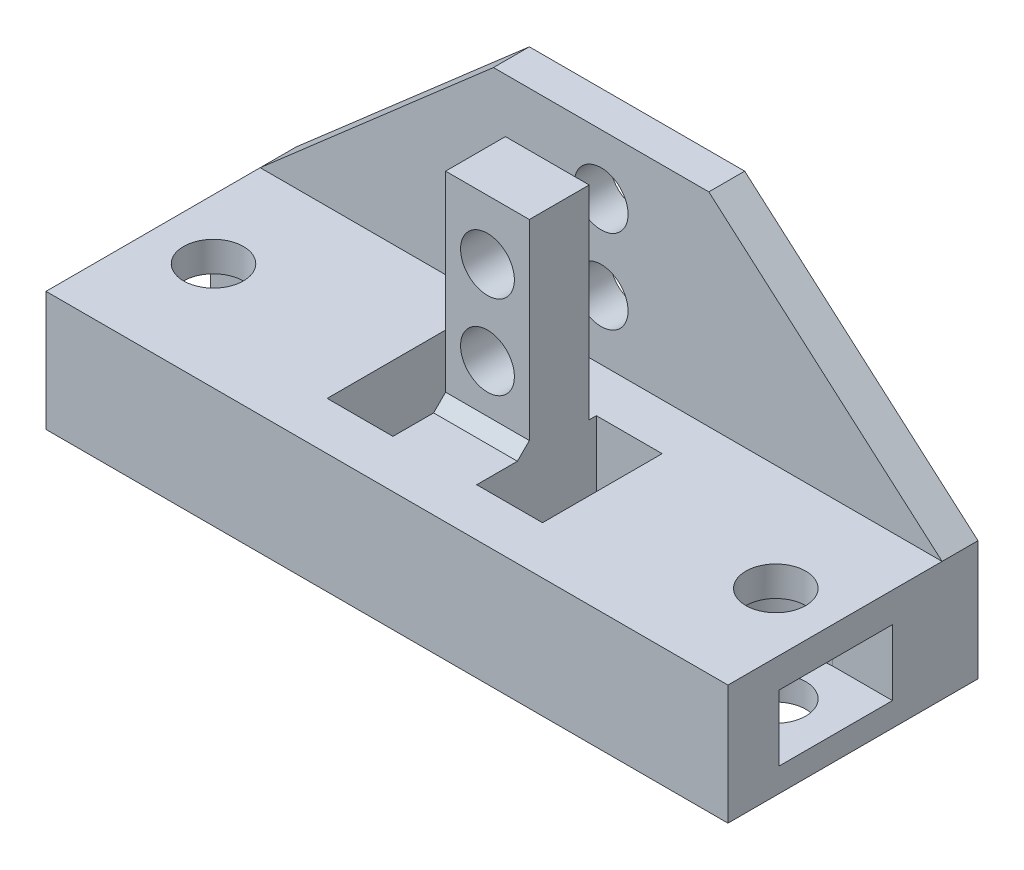
ISO-10303-21;
HEADER;
FILE_DESCRIPTION(('STEP AP214'),'2;1');
FILE_NAME('part.step','',(''),(''),'','','');
FILE_SCHEMA(('AUTOMOTIVE_DESIGN { 1 0 10303 214 1 1 1 1 }'));
ENDSEC;
DATA;
#1=APPLICATION_CONTEXT('core data for automotive mechanical design processes');
#2=APPLICATION_PROTOCOL_DEFINITION('international standard','automotive_design',2000,#1);
#3=PRODUCT_CONTEXT('',#1,'mechanical');
#4=PRODUCT('Part','Part','',(#3));
#5=PRODUCT_RELATED_PRODUCT_CATEGORY('part','',(#4));
#6=PRODUCT_DEFINITION_FORMATION('','',#4);
#7=PRODUCT_DEFINITION_CONTEXT('part definition',#1,'design');
#8=PRODUCT_DEFINITION('design','',#6,#7);
#9=PRODUCT_DEFINITION_SHAPE('','',#8);
#10=(LENGTH_UNIT() NAMED_UNIT(*) SI_UNIT(.MILLI.,.METRE.));
#11=(NAMED_UNIT(*) PLANE_ANGLE_UNIT() SI_UNIT($,.RADIAN.));
#12=(NAMED_UNIT(*) SI_UNIT($,.STERADIAN.) SOLID_ANGLE_UNIT());
#13=UNCERTAINTY_MEASURE_WITH_UNIT(LENGTH_MEASURE(1.E-05),#10,'distance_accuracy_value','');
#14=(GEOMETRIC_REPRESENTATION_CONTEXT(3) GLOBAL_UNCERTAINTY_ASSIGNED_CONTEXT((#13)) GLOBAL_UNIT_ASSIGNED_CONTEXT((#10,
#11,#12)) REPRESENTATION_CONTEXT('',''));
#15=CARTESIAN_POINT('',(0.,0.,0.));
#16=DIRECTION('',(0.,0.,1.));
#17=DIRECTION('',(1.,0.,0.));
#18=AXIS2_PLACEMENT_3D('',#15,#16,#17);
#19=CARTESIAN_POINT('',(38.5,0.,0.));
#20=DIRECTION('',(1.,0.,0.));
#21=DIRECTION('',(0.,0.,-1.));
#22=AXIS2_PLACEMENT_3D('',#19,#20,#21);
#23=PLANE('',#22);
#24=DIRECTION('',(0.,-1.,0.));
#25=VECTOR('',#24,1.);
#26=CARTESIAN_POINT('',(38.5,0.,13.4));
#27=LINE('',#26,#25);
#28=CARTESIAN_POINT('',(38.5,0.,13.4));
#29=VERTEX_POINT('',#28);
#30=CARTESIAN_POINT('',(38.5,-10.,13.4));
#31=VERTEX_POINT('',#30);
#32=EDGE_CURVE('E364',#29,#31,#27,.T.);
#33=ORIENTED_EDGE('',*,*,#32,.T.);
#34=DIRECTION('',(0.,0.,-1.));
#35=VECTOR('',#34,1.);
#36=CARTESIAN_POINT('',(38.5,-10.,13.4));
#37=LINE('',#36,#35);
#38=CARTESIAN_POINT('',(38.5,-10.,-7.5));
#39=VERTEX_POINT('',#38);
#40=EDGE_CURVE('E367',#31,#39,#37,.T.);
#41=ORIENTED_EDGE('',*,*,#40,.T.);
#42=DIRECTION('',(0.,1.,0.));
#43=VECTOR('',#42,1.);
#44=CARTESIAN_POINT('',(38.5,0.,-7.5));
#45=LINE('',#44,#43);
#46=CARTESIAN_POINT('',(38.5,0.,-7.5));
#47=VERTEX_POINT('',#46);
#48=EDGE_CURVE('E360',#39,#47,#45,.T.);
#49=ORIENTED_EDGE('',*,*,#48,.T.);
#50=DIRECTION('',(0.,0.,1.));
#51=VECTOR('',#50,1.);
#52=CARTESIAN_POINT('',(38.5,0.,13.4));
#53=LINE('',#52,#51);
#54=CARTESIAN_POINT('',(38.5,0.,-4.5));
#55=VERTEX_POINT('',#54);
#56=EDGE_CURVE('E371',#47,#55,#53,.T.);
#57=ORIENTED_EDGE('',*,*,#56,.T.);
#58=EDGE_CURVE('E370',#55,#29,#53,.T.);
#59=ORIENTED_EDGE('',*,*,#58,.T.);
#60=EDGE_LOOP('',(#33,#41,#49,#57,#59));
#61=FACE_BOUND('',#60,.T.);
#62=DIRECTION('',(0.,-1.,0.));
#63=VECTOR('',#62,1.);
#64=CARTESIAN_POINT('',(38.5,-2.5,9.15));
#65=LINE('',#64,#63);
#66=CARTESIAN_POINT('',(38.5,-2.5,9.15));
#67=VERTEX_POINT('',#66);
#68=CARTESIAN_POINT('',(38.5,-8.,9.15));
#69=VERTEX_POINT('',#68);
#70=EDGE_CURVE('E50',#67,#69,#65,.T.);
#71=ORIENTED_EDGE('',*,*,#70,.F.);
#72=DIRECTION('',(0.,0.,-1.));
#73=VECTOR('',#72,1.);
#74=CARTESIAN_POINT('',(38.5,-2.5,0.));
#75=LINE('',#74,#73);
#76=CARTESIAN_POINT('',(38.5,-2.5,-0.35));
#77=VERTEX_POINT('',#76);
#78=EDGE_CURVE('E232',#67,#77,#75,.T.);
#79=ORIENTED_EDGE('',*,*,#78,.T.);
#80=DIRECTION('',(0.,-1.,0.));
#81=VECTOR('',#80,1.);
#82=CARTESIAN_POINT('',(38.5,-2.5,-0.35));
#83=LINE('',#82,#81);
#84=CARTESIAN_POINT('',(38.5,-8.,-0.35));
#85=VERTEX_POINT('',#84);
#86=EDGE_CURVE('E227',#77,#85,#83,.T.);
#87=ORIENTED_EDGE('',*,*,#86,.T.);
#88=DIRECTION('',(0.,0.,-1.));
#89=VECTOR('',#88,1.);
#90=CARTESIAN_POINT('',(38.5,-8.,0.));
#91=LINE('',#90,#89);
#92=EDGE_CURVE('E259',#69,#85,#91,.T.);
#93=ORIENTED_EDGE('',*,*,#92,.F.);
#94=EDGE_LOOP('',(#71,#79,#87,#93));
#95=FACE_BOUND('',#94,.T.);
#96=ADVANCED_FACE('F35',(#61,#95),#23,.T.);
#97=CARTESIAN_POINT('',(33.5,-10.,4.4));
#98=DIRECTION('',(0.,1.,0.));
#99=DIRECTION('',(0.,0.,1.));
#100=AXIS2_PLACEMENT_3D('',#97,#98,#99);
#101=CYLINDRICAL_SURFACE('',#100,2.5);
#102=CARTESIAN_POINT('',(33.5,0.,4.4));
#103=DIRECTION('',(0.,1.,0.));
#104=DIRECTION('',(0.,0.,1.));
#105=AXIS2_PLACEMENT_3D('',#102,#103,#104);
#106=CIRCLE('',#105,2.5);
#107=CARTESIAN_POINT('',(33.5,0.,6.9));
#108=VERTEX_POINT('',#107);
#109=EDGE_CURVE('E296',#108,#108,#106,.T.);
#110=ORIENTED_EDGE('',*,*,#109,.T.);
#111=EDGE_LOOP('',(#110));
#112=FACE_BOUND('',#111,.T.);
#113=CARTESIAN_POINT('',(33.5,-2.5,4.4));
#114=DIRECTION('',(0.,1.,0.));
#115=DIRECTION('',(-1.,0.,0.));
#116=AXIS2_PLACEMENT_3D('',#113,#114,#115);
#117=CIRCLE('',#116,2.5);
#118=CARTESIAN_POINT('',(31.,-2.5,4.4));
#119=VERTEX_POINT('',#118);
#120=EDGE_CURVE('E245',#119,#119,#117,.F.);
#121=ORIENTED_EDGE('',*,*,#120,.T.);
#122=EDGE_LOOP('',(#121));
#123=FACE_BOUND('',#122,.T.);
#124=ADVANCED_FACE('F546',(#112,#123),#101,.F.);
#125=CARTESIAN_POINT('',(-18.5,0.,0.));
#126=DIRECTION('',(-1.,0.,0.));
#127=DIRECTION('',(0.,0.,-1.));
#128=AXIS2_PLACEMENT_3D('',#125,#126,#127);
#129=PLANE('',#128);
#130=DIRECTION('',(0.,-1.,0.));
#131=VECTOR('',#130,1.);
#132=CARTESIAN_POINT('',(-18.5,0.,13.4));
#133=LINE('',#132,#131);
#134=CARTESIAN_POINT('',(-18.5,0.,13.4));
#135=VERTEX_POINT('',#134);
#136=CARTESIAN_POINT('',(-18.5,-10.,13.4));
#137=VERTEX_POINT('',#136);
#138=EDGE_CURVE('E332',#135,#137,#133,.T.);
#139=ORIENTED_EDGE('',*,*,#138,.F.);
#140=DIRECTION('',(0.,0.,1.));
#141=VECTOR('',#140,1.);
#142=CARTESIAN_POINT('',(-18.5,0.,13.4));
#143=LINE('',#142,#141);
#144=CARTESIAN_POINT('',(-18.5,0.,-4.49999999999999));
#145=VERTEX_POINT('',#144);
#146=EDGE_CURVE('E335',#145,#135,#143,.T.);
#147=ORIENTED_EDGE('',*,*,#146,.F.);
#148=CARTESIAN_POINT('',(-18.5,0.,-7.5));
#149=VERTEX_POINT('',#148);
#150=EDGE_CURVE('E336',#149,#145,#143,.T.);
#151=ORIENTED_EDGE('',*,*,#150,.F.);
#152=DIRECTION('',(0.,1.,0.));
#153=VECTOR('',#152,1.);
#154=CARTESIAN_POINT('',(-18.5,0.,-7.5));
#155=LINE('',#154,#153);
#156=CARTESIAN_POINT('',(-18.5,-10.,-7.5));
#157=VERTEX_POINT('',#156);
#158=EDGE_CURVE('E326',#157,#149,#155,.T.);
#159=ORIENTED_EDGE('',*,*,#158,.F.);
#160=DIRECTION('',(0.,0.,-1.));
#161=VECTOR('',#160,1.);
#162=CARTESIAN_POINT('',(-18.5,-10.,13.4));
#163=LINE('',#162,#161);
#164=EDGE_CURVE('E339',#137,#157,#163,.T.);
#165=ORIENTED_EDGE('',*,*,#164,.F.);
#166=EDGE_LOOP('',(#139,#147,#151,#159,#165));
#167=FACE_BOUND('',#166,.T.);
#168=DIRECTION('',(0.,-1.,0.));
#169=VECTOR('',#168,1.);
#170=CARTESIAN_POINT('',(-18.5,-2.5,-0.35));
#171=LINE('',#170,#169);
#172=CARTESIAN_POINT('',(-18.5,-2.5,-0.35));
#173=VERTEX_POINT('',#172);
#174=CARTESIAN_POINT('',(-18.5,-8.,-0.35));
#175=VERTEX_POINT('',#174);
#176=EDGE_CURVE('E297',#173,#175,#171,.T.);
#177=ORIENTED_EDGE('',*,*,#176,.F.);
#178=DIRECTION('',(0.,0.,-1.));
#179=VECTOR('',#178,1.);
#180=CARTESIAN_POINT('',(-18.5,-2.5,0.));
#181=LINE('',#180,#179);
#182=CARTESIAN_POINT('',(-18.5,-2.5,9.15));
#183=VERTEX_POINT('',#182);
#184=EDGE_CURVE('E276',#183,#173,#181,.T.);
#185=ORIENTED_EDGE('',*,*,#184,.F.);
#186=DIRECTION('',(0.,-1.,0.));
#187=VECTOR('',#186,1.);
#188=CARTESIAN_POINT('',(-18.5,-2.5,9.15));
#189=LINE('',#188,#187);
#190=CARTESIAN_POINT('',(-18.5,-8.,9.15));
#191=VERTEX_POINT('',#190);
#192=EDGE_CURVE('E299',#183,#191,#189,.T.);
#193=ORIENTED_EDGE('',*,*,#192,.T.);
#194=DIRECTION('',(0.,0.,-1.));
#195=VECTOR('',#194,1.);
#196=CARTESIAN_POINT('',(-18.5,-8.,0.));
#197=LINE('',#196,#195);
#198=EDGE_CURVE('E290',#191,#175,#197,.T.);
#199=ORIENTED_EDGE('',*,*,#198,.T.);
#200=EDGE_LOOP('',(#177,#185,#193,#199));
#201=FACE_BOUND('',#200,.T.);
#202=ADVANCED_FACE('F552',(#167,#201),#129,.T.);
#203=CARTESIAN_POINT('',(-13.5,-10.,4.4));
#204=DIRECTION('',(0.,1.,0.));
#205=DIRECTION('',(0.,0.,1.));
#206=AXIS2_PLACEMENT_3D('',#203,#204,#205);
#207=CYLINDRICAL_SURFACE('',#206,2.5);
#208=CARTESIAN_POINT('',(-13.5,0.,4.4));
#209=DIRECTION('',(0.,1.,0.));
#210=DIRECTION('',(0.,0.,1.));
#211=AXIS2_PLACEMENT_3D('',#208,#209,#210);
#212=CIRCLE('',#211,2.5);
#213=CARTESIAN_POINT('',(-13.5,0.,6.9));
#214=VERTEX_POINT('',#213);
#215=EDGE_CURVE('E306',#214,#214,#212,.T.);
#216=ORIENTED_EDGE('',*,*,#215,.T.);
#217=EDGE_LOOP('',(#216));
#218=FACE_BOUND('',#217,.T.);
#219=CARTESIAN_POINT('',(-13.5,-2.5,4.4));
#220=DIRECTION('',(0.,-1.,0.));
#221=DIRECTION('',(1.,0.,0.));
#222=AXIS2_PLACEMENT_3D('',#219,#220,#221);
#223=CIRCLE('',#222,2.5);
#224=CARTESIAN_POINT('',(-11.,-2.5,4.4));
#225=VERTEX_POINT('',#224);
#226=EDGE_CURVE('E267',#225,#225,#223,.F.);
#227=ORIENTED_EDGE('',*,*,#226,.F.);
#228=EDGE_LOOP('',(#227));
#229=FACE_BOUND('',#228,.T.);
#230=ADVANCED_FACE('F611',(#218,#229),#207,.F.);
#231=CARTESIAN_POINT('',(0.,-10.,-0.6));
#232=DIRECTION('',(0.,0.,1.));
#233=DIRECTION('',(1.,0.,0.));
#234=AXIS2_PLACEMENT_3D('',#231,#232,#233);
#235=PLANE('',#234);
#236=DIRECTION('',(1.,0.,0.));
#237=VECTOR('',#236,1.);
#238=CARTESIAN_POINT('',(0.,-10.,-0.6));
#239=LINE('',#238,#237);
#240=CARTESIAN_POINT('',(13.5,-10.,-0.6));
#241=VERTEX_POINT('',#240);
#242=CARTESIAN_POINT('',(19.,-10.,-0.6));
#243=VERTEX_POINT('',#242);
#244=EDGE_CURVE('E466',#241,#243,#239,.T.);
#245=ORIENTED_EDGE('',*,*,#244,.T.);
#246=DIRECTION('',(0.,-1.,0.));
#247=VECTOR('',#246,1.);
#248=CARTESIAN_POINT('',(19.,0.,-0.6));
#249=LINE('',#248,#247);
#250=CARTESIAN_POINT('',(19.,0.,-0.6));
#251=VERTEX_POINT('',#250);
#252=EDGE_CURVE('E354',#251,#243,#249,.T.);
#253=ORIENTED_EDGE('',*,*,#252,.F.);
#254=DIRECTION('',(1.,0.,0.));
#255=VECTOR('',#254,1.);
#256=CARTESIAN_POINT('',(0.,0.,-0.6));
#257=LINE('',#256,#255);
#258=CARTESIAN_POINT('',(13.5,0.,-0.6));
#259=VERTEX_POINT('',#258);
#260=EDGE_CURVE('E462',#259,#251,#257,.T.);
#261=ORIENTED_EDGE('',*,*,#260,.F.);
#262=DIRECTION('',(0.,-1.,0.));
#263=VECTOR('',#262,1.);
#264=CARTESIAN_POINT('',(13.5,-10.,-0.6));
#265=LINE('',#264,#263);
#266=EDGE_CURVE('E456',#259,#241,#265,.T.);
#267=ORIENTED_EDGE('',*,*,#266,.T.);
#268=EDGE_LOOP('',(#245,#253,#261,#267));
#269=FACE_BOUND('',#268,.T.);
#270=ADVANCED_FACE('F562',(#269),#235,.T.);
#271=CARTESIAN_POINT('',(38.5,0.,9.4));
#272=DIRECTION('',(0.,0.,1.));
#273=DIRECTION('',(1.,0.,0.));
#274=AXIS2_PLACEMENT_3D('',#271,#272,#273);
#275=PLANE('',#274);
#276=DIRECTION('',(0.,1.,0.));
#277=VECTOR('',#276,1.);
#278=CARTESIAN_POINT('',(19.,0.,9.4));
#279=LINE('',#278,#277);
#280=CARTESIAN_POINT('',(19.,-10.,9.4));
#281=VERTEX_POINT('',#280);
#282=CARTESIAN_POINT('',(19.,0.,9.4));
#283=VERTEX_POINT('',#282);
#284=EDGE_CURVE('E465',#281,#283,#279,.T.);
#285=ORIENTED_EDGE('',*,*,#284,.F.);
#286=DIRECTION('',(-1.,0.,0.));
#287=VECTOR('',#286,1.);
#288=CARTESIAN_POINT('',(38.5,-10.,9.4));
#289=LINE('',#288,#287);
#290=CARTESIAN_POINT('',(13.5,-10.,9.4));
#291=VERTEX_POINT('',#290);
#292=EDGE_CURVE('E378',#281,#291,#289,.T.);
#293=ORIENTED_EDGE('',*,*,#292,.T.);
#294=DIRECTION('',(0.,1.,0.));
#295=VECTOR('',#294,1.);
#296=CARTESIAN_POINT('',(13.5,0.,9.4));
#297=LINE('',#296,#295);
#298=CARTESIAN_POINT('',(13.5,0.,9.4));
#299=VERTEX_POINT('',#298);
#300=EDGE_CURVE('E363',#291,#299,#297,.T.);
#301=ORIENTED_EDGE('',*,*,#300,.T.);
#302=DIRECTION('',(-1.,0.,0.));
#303=VECTOR('',#302,1.);
#304=CARTESIAN_POINT('',(38.5,0.,9.4));
#305=LINE('',#304,#303);
#306=EDGE_CURVE('E374',#283,#299,#305,.T.);
#307=ORIENTED_EDGE('',*,*,#306,.F.);
#308=EDGE_LOOP('',(#285,#293,#301,#307));
#309=FACE_BOUND('',#308,.T.);
#310=ADVANCED_FACE('F559',(#309),#275,.F.);
#311=CARTESIAN_POINT('',(13.5,0.,13.4));
#312=DIRECTION('',(-1.,0.,0.));
#313=DIRECTION('',(0.,0.,1.));
#314=AXIS2_PLACEMENT_3D('',#311,#312,#313);
#315=PLANE('',#314);
#316=ORIENTED_EDGE('',*,*,#300,.F.);
#317=DIRECTION('',(0.,0.,-1.));
#318=VECTOR('',#317,1.);
#319=CARTESIAN_POINT('',(13.5,-10.,13.4));
#320=LINE('',#319,#318);
#321=EDGE_CURVE('E451',#291,#241,#320,.T.);
#322=ORIENTED_EDGE('',*,*,#321,.T.);
#323=ORIENTED_EDGE('',*,*,#266,.F.);
#324=DIRECTION('',(0.,0.,-1.));
#325=VECTOR('',#324,1.);
#326=CARTESIAN_POINT('',(13.5,0.,13.4));
#327=LINE('',#326,#325);
#328=CARTESIAN_POINT('',(13.5,0.,0.));
#329=VERTEX_POINT('',#328);
#330=EDGE_CURVE('E447',#329,#259,#327,.T.);
#331=ORIENTED_EDGE('',*,*,#330,.F.);
#332=DIRECTION('',(0.,-1.,0.));
#333=VECTOR('',#332,1.);
#334=CARTESIAN_POINT('',(13.5,0.,0.));
#335=LINE('',#334,#333);
#336=CARTESIAN_POINT('',(13.5,17.,0.));
#337=VERTEX_POINT('',#336);
#338=EDGE_CURVE('E429',#337,#329,#335,.T.);
#339=ORIENTED_EDGE('',*,*,#338,.F.);
#340=DIRECTION('',(0.,0.,1.));
#341=VECTOR('',#340,1.);
#342=CARTESIAN_POINT('',(13.5,17.,-13.));
#343=LINE('',#342,#341);
#344=CARTESIAN_POINT('',(13.5,17.,5.));
#345=VERTEX_POINT('',#344);
#346=EDGE_CURVE('E423',#337,#345,#343,.T.);
#347=ORIENTED_EDGE('',*,*,#346,.T.);
#348=DIRECTION('',(0.,-1.,0.));
#349=VECTOR('',#348,1.);
#350=CARTESIAN_POINT('',(13.5,17.,5.));
#351=LINE('',#350,#349);
#352=CARTESIAN_POINT('',(13.5,1.,5.));
#353=VERTEX_POINT('',#352);
#354=EDGE_CURVE('E420',#345,#353,#351,.T.);
#355=ORIENTED_EDGE('',*,*,#354,.T.);
#356=DIRECTION('',(0.,-0.70710678118655,0.707106781186545));
#357=VECTOR('',#356,1.);
#358=CARTESIAN_POINT('',(13.5,-3.7,9.69999999999997));
#359=LINE('',#358,#357);
#360=CARTESIAN_POINT('',(13.5,0.,5.99999999999999));
#361=VERTEX_POINT('',#360);
#362=EDGE_CURVE('E43',#353,#361,#359,.T.);
#363=ORIENTED_EDGE('',*,*,#362,.T.);
#364=EDGE_CURVE('E448',#299,#361,#327,.T.);
#365=ORIENTED_EDGE('',*,*,#364,.F.);
#366=EDGE_LOOP('',(#316,#322,#323,#331,#339,#347,#355,#363,#365));
#367=FACE_BOUND('',#366,.T.);
#368=ADVANCED_FACE('F485',(#367),#315,.F.);
#369=DIRECTION('',(0.,-1.,0.));
#370=VECTOR('',#369,1.);
#371=CARTESIAN_POINT('',(0.999999999999997,0.,-0.6));
#372=LINE('',#371,#370);
#373=CARTESIAN_POINT('',(0.999999999999997,0.,-0.6));
#374=VERTEX_POINT('',#373);
#375=CARTESIAN_POINT('',(0.999999999999999,-10.,-0.6));
#376=VERTEX_POINT('',#375);
#377=EDGE_CURVE('E320',#374,#376,#372,.T.);
#378=ORIENTED_EDGE('',*,*,#377,.T.);
#379=CARTESIAN_POINT('',(6.5,-10.,-0.6));
#380=VERTEX_POINT('',#379);
#381=EDGE_CURVE('E463',#376,#380,#239,.T.);
#382=ORIENTED_EDGE('',*,*,#381,.T.);
#383=DIRECTION('',(0.,1.,0.));
#384=VECTOR('',#383,1.);
#385=CARTESIAN_POINT('',(6.5,-10.,-0.6));
#386=LINE('',#385,#384);
#387=CARTESIAN_POINT('',(6.5,0.,-0.6));
#388=VERTEX_POINT('',#387);
#389=EDGE_CURVE('E459',#380,#388,#386,.T.);
#390=ORIENTED_EDGE('',*,*,#389,.T.);
#391=EDGE_CURVE('E467',#374,#388,#257,.T.);
#392=ORIENTED_EDGE('',*,*,#391,.F.);
#393=EDGE_LOOP('',(#378,#382,#390,#392));
#394=FACE_BOUND('',#393,.T.);
#395=ADVANCED_FACE('F518',(#394),#235,.T.);
#396=CARTESIAN_POINT('',(0.,-10.,0.));
#397=DIRECTION('',(0.,-1.,0.));
#398=DIRECTION('',(0.,0.,-1.));
#399=AXIS2_PLACEMENT_3D('',#396,#397,#398);
#400=PLANE('',#399);
#401=CARTESIAN_POINT('',(33.5,-10.,4.4));
#402=DIRECTION('',(0.,1.,0.));
#403=DIRECTION('',(0.,0.,1.));
#404=AXIS2_PLACEMENT_3D('',#401,#402,#403);
#405=CIRCLE('',#404,2.5);
#406=CARTESIAN_POINT('',(33.5,-10.,6.9));
#407=VERTEX_POINT('',#406);
#408=EDGE_CURVE('E303',#407,#407,#405,.T.);
#409=ORIENTED_EDGE('',*,*,#408,.T.);
#410=EDGE_LOOP('',(#409));
#411=FACE_BOUND('',#410,.T.);
#412=CARTESIAN_POINT('',(-13.5,-10.,4.4));
#413=DIRECTION('',(0.,1.,0.));
#414=DIRECTION('',(0.,0.,1.));
#415=AXIS2_PLACEMENT_3D('',#412,#413,#414);
#416=CIRCLE('',#415,2.5);
#417=CARTESIAN_POINT('',(-13.5,-10.,6.9));
#418=VERTEX_POINT('',#417);
#419=EDGE_CURVE('E309',#418,#418,#416,.T.);
#420=ORIENTED_EDGE('',*,*,#419,.T.);
#421=EDGE_LOOP('',(#420));
#422=FACE_BOUND('',#421,.T.);
#423=ORIENTED_EDGE('',*,*,#381,.F.);
#424=DIRECTION('',(0.,0.,-1.));
#425=VECTOR('',#424,1.);
#426=CARTESIAN_POINT('',(0.999999999999997,-10.,35.3146070008111));
#427=LINE('',#426,#425);
#428=CARTESIAN_POINT('',(0.999999999999997,-10.,9.4));
#429=VERTEX_POINT('',#428);
#430=EDGE_CURVE('E323',#429,#376,#427,.T.);
#431=ORIENTED_EDGE('',*,*,#430,.F.);
#432=DIRECTION('',(1.,0.,0.));
#433=VECTOR('',#432,1.);
#434=CARTESIAN_POINT('',(-18.5,-10.,9.4));
#435=LINE('',#434,#433);
#436=CARTESIAN_POINT('',(6.5,-10.,9.4));
#437=VERTEX_POINT('',#436);
#438=EDGE_CURVE('E341',#429,#437,#435,.T.);
#439=ORIENTED_EDGE('',*,*,#438,.T.);
#440=DIRECTION('',(0.,0.,-1.));
#441=VECTOR('',#440,1.);
#442=CARTESIAN_POINT('',(6.5,-10.,13.4));
#443=LINE('',#442,#441);
#444=EDGE_CURVE('E453',#437,#380,#443,.T.);
#445=ORIENTED_EDGE('',*,*,#444,.T.);
#446=EDGE_LOOP('',(#423,#431,#439,#445));
#447=FACE_BOUND('',#446,.T.);
#448=ORIENTED_EDGE('',*,*,#40,.F.);
#449=DIRECTION('',(1.,0.,0.));
#450=VECTOR('',#449,1.);
#451=CARTESIAN_POINT('',(6.5,-10.,13.4));
#452=LINE('',#451,#450);
#453=EDGE_CURVE('E438',#137,#31,#452,.T.);
#454=ORIENTED_EDGE('',*,*,#453,.F.);
#455=ORIENTED_EDGE('',*,*,#164,.T.);
#456=DIRECTION('',(1.,0.,0.));
#457=VECTOR('',#456,1.);
#458=CARTESIAN_POINT('',(1.,-10.,-7.5));
#459=LINE('',#458,#457);
#460=EDGE_CURVE('E400',#157,#39,#459,.T.);
#461=ORIENTED_EDGE('',*,*,#460,.T.);
#462=EDGE_LOOP('',(#448,#454,#455,#461));
#463=FACE_BOUND('',#462,.T.);
#464=ORIENTED_EDGE('',*,*,#292,.F.);
#465=DIRECTION('',(0.,0.,-1.));
#466=VECTOR('',#465,1.);
#467=CARTESIAN_POINT('',(19.,-10.,35.3146070008111));
#468=LINE('',#467,#466);
#469=EDGE_CURVE('E357',#281,#243,#468,.T.);
#470=ORIENTED_EDGE('',*,*,#469,.T.);
#471=ORIENTED_EDGE('',*,*,#244,.F.);
#472=ORIENTED_EDGE('',*,*,#321,.F.);
#473=EDGE_LOOP('',(#464,#470,#471,#472));
#474=FACE_BOUND('',#473,.T.);
#475=ADVANCED_FACE('F523',(#411,#422,#447,#463,#474),#400,.T.);
#476=CARTESIAN_POINT('',(0.,0.,0.));
#477=DIRECTION('',(0.,-1.,0.));
#478=DIRECTION('',(0.,0.,-1.));
#479=AXIS2_PLACEMENT_3D('',#476,#477,#478);
#480=PLANE('',#479);
#481=ORIENTED_EDGE('',*,*,#109,.F.);
#482=EDGE_LOOP('',(#481));
#483=FACE_BOUND('',#482,.T.);
#484=ORIENTED_EDGE('',*,*,#215,.F.);
#485=EDGE_LOOP('',(#484));
#486=FACE_BOUND('',#485,.T.);
#487=ORIENTED_EDGE('',*,*,#364,.T.);
#488=DIRECTION('',(-1.,0.,0.));
#489=VECTOR('',#488,1.);
#490=CARTESIAN_POINT('',(0.,0.,5.99999999999999));
#491=LINE('',#490,#489);
#492=CARTESIAN_POINT('',(6.5,0.,5.99999999999999));
#493=VERTEX_POINT('',#492);
#494=EDGE_CURVE('E481',#361,#493,#491,.T.);
#495=ORIENTED_EDGE('',*,*,#494,.T.);
#496=DIRECTION('',(0.,0.,-1.));
#497=VECTOR('',#496,1.);
#498=CARTESIAN_POINT('',(6.5,0.,13.4));
#499=LINE('',#498,#497);
#500=CARTESIAN_POINT('',(6.5,0.,9.4));
#501=VERTEX_POINT('',#500);
#502=EDGE_CURVE('E444',#501,#493,#499,.T.);
#503=ORIENTED_EDGE('',*,*,#502,.F.);
#504=DIRECTION('',(1.,0.,0.));
#505=VECTOR('',#504,1.);
#506=CARTESIAN_POINT('',(-18.5,0.,9.4));
#507=LINE('',#506,#505);
#508=CARTESIAN_POINT('',(0.999999999999997,0.,9.4));
#509=VERTEX_POINT('',#508);
#510=EDGE_CURVE('E345',#509,#501,#507,.T.);
#511=ORIENTED_EDGE('',*,*,#510,.F.);
#512=DIRECTION('',(0.,0.,-1.));
#513=VECTOR('',#512,1.);
#514=CARTESIAN_POINT('',(0.999999999999997,0.,35.3146070008111));
#515=LINE('',#514,#513);
#516=EDGE_CURVE('E322',#509,#374,#515,.T.);
#517=ORIENTED_EDGE('',*,*,#516,.T.);
#518=ORIENTED_EDGE('',*,*,#391,.T.);
#519=CARTESIAN_POINT('',(6.5,0.,0.));
#520=VERTEX_POINT('',#519);
#521=EDGE_CURVE('E443',#520,#388,#499,.T.);
#522=ORIENTED_EDGE('',*,*,#521,.F.);
#523=DIRECTION('',(1.,0.,0.));
#524=VECTOR('',#523,1.);
#525=CARTESIAN_POINT('',(0.,0.,0.));
#526=LINE('',#525,#524);
#527=EDGE_CURVE('E426',#520,#329,#526,.T.);
#528=ORIENTED_EDGE('',*,*,#527,.T.);
#529=ORIENTED_EDGE('',*,*,#330,.T.);
#530=ORIENTED_EDGE('',*,*,#260,.T.);
#531=DIRECTION('',(0.,0.,-1.));
#532=VECTOR('',#531,1.);
#533=CARTESIAN_POINT('',(19.,0.,35.3146070008111));
#534=LINE('',#533,#532);
#535=EDGE_CURVE('E353',#283,#251,#534,.T.);
#536=ORIENTED_EDGE('',*,*,#535,.F.);
#537=ORIENTED_EDGE('',*,*,#306,.T.);
#538=EDGE_LOOP('',(#487,#495,#503,#511,#517,#518,#522,#528,#529,#530,#536,#537));
#539=FACE_BOUND('',#538,.T.);
#540=DIRECTION('',(-1.,0.,0.));
#541=VECTOR('',#540,1.);
#542=CARTESIAN_POINT('',(0.,0.,-4.5));
#543=LINE('',#542,#541);
#544=EDGE_CURVE('E402',#55,#145,#543,.T.);
#545=ORIENTED_EDGE('',*,*,#544,.T.);
#546=ORIENTED_EDGE('',*,*,#146,.T.);
#547=DIRECTION('',(-1.,0.,0.));
#548=VECTOR('',#547,1.);
#549=CARTESIAN_POINT('',(6.5,0.,13.4));
#550=LINE('',#549,#548);
#551=EDGE_CURVE('E440',#29,#135,#550,.T.);
#552=ORIENTED_EDGE('',*,*,#551,.F.);
#553=ORIENTED_EDGE('',*,*,#58,.F.);
#554=EDGE_LOOP('',(#545,#546,#552,#553));
#555=FACE_BOUND('',#554,.T.);
#556=ADVANCED_FACE('F491',(#483,#486,#539,#555),#480,.F.);
#557=CARTESIAN_POINT('',(6.5,0.,13.4));
#558=DIRECTION('',(1.,0.,0.));
#559=DIRECTION('',(0.,1.,0.));
#560=AXIS2_PLACEMENT_3D('',#557,#558,#559);
#561=PLANE('',#560);
#562=ORIENTED_EDGE('',*,*,#444,.F.);
#563=DIRECTION('',(0.,1.,0.));
#564=VECTOR('',#563,1.);
#565=CARTESIAN_POINT('',(6.5,0.,9.4));
#566=LINE('',#565,#564);
#567=EDGE_CURVE('E331',#437,#501,#566,.T.);
#568=ORIENTED_EDGE('',*,*,#567,.T.);
#569=ORIENTED_EDGE('',*,*,#502,.T.);
#570=DIRECTION('',(0.,0.70710678118655,-0.707106781186545));
#571=VECTOR('',#570,1.);
#572=CARTESIAN_POINT('',(6.5,-3.7,9.69999999999997));
#573=LINE('',#572,#571);
#574=CARTESIAN_POINT('',(6.5,1.,5.));
#575=VERTEX_POINT('',#574);
#576=EDGE_CURVE('E11',#493,#575,#573,.T.);
#577=ORIENTED_EDGE('',*,*,#576,.T.);
#578=DIRECTION('',(0.,1.,0.));
#579=VECTOR('',#578,1.);
#580=CARTESIAN_POINT('',(6.5,0.,5.));
#581=LINE('',#580,#579);
#582=CARTESIAN_POINT('',(6.5,17.,5.));
#583=VERTEX_POINT('',#582);
#584=EDGE_CURVE('E414',#575,#583,#581,.T.);
#585=ORIENTED_EDGE('',*,*,#584,.T.);
#586=DIRECTION('',(0.,0.,1.));
#587=VECTOR('',#586,1.);
#588=CARTESIAN_POINT('',(6.5,17.,-13.));
#589=LINE('',#588,#587);
#590=CARTESIAN_POINT('',(6.5,17.,0.));
#591=VERTEX_POINT('',#590);
#592=EDGE_CURVE('E417',#591,#583,#589,.T.);
#593=ORIENTED_EDGE('',*,*,#592,.F.);
#594=DIRECTION('',(0.,1.,0.));
#595=VECTOR('',#594,1.);
#596=CARTESIAN_POINT('',(6.5,0.,0.));
#597=LINE('',#596,#595);
#598=EDGE_CURVE('E435',#520,#591,#597,.T.);
#599=ORIENTED_EDGE('',*,*,#598,.F.);
#600=ORIENTED_EDGE('',*,*,#521,.T.);
#601=ORIENTED_EDGE('',*,*,#389,.F.);
#602=EDGE_LOOP('',(#562,#568,#569,#577,#585,#593,#599,#600,#601));
#603=FACE_BOUND('',#602,.T.);
#604=ADVANCED_FACE('F499',(#603),#561,.F.);
#605=CARTESIAN_POINT('',(0.,0.,13.4));
#606=DIRECTION('',(0.,0.,1.));
#607=DIRECTION('',(1.,0.,0.));
#608=AXIS2_PLACEMENT_3D('',#605,#606,#607);
#609=PLANE('',#608);
#610=ORIENTED_EDGE('',*,*,#551,.T.);
#611=ORIENTED_EDGE('',*,*,#138,.T.);
#612=ORIENTED_EDGE('',*,*,#453,.T.);
#613=ORIENTED_EDGE('',*,*,#32,.F.);
#614=EDGE_LOOP('',(#610,#611,#612,#613));
#615=FACE_BOUND('',#614,.T.);
#616=ADVANCED_FACE('F594',(#615),#609,.T.);
#617=CARTESIAN_POINT('',(0.,17.,5.));
#618=DIRECTION('',(0.,1.,0.));
#619=DIRECTION('',(0.,0.,1.));
#620=AXIS2_PLACEMENT_3D('',#617,#618,#619);
#621=PLANE('',#620);
#622=ORIENTED_EDGE('',*,*,#592,.T.);
#623=DIRECTION('',(1.,0.,0.));
#624=VECTOR('',#623,1.);
#625=CARTESIAN_POINT('',(0.,17.,5.));
#626=LINE('',#625,#624);
#627=EDGE_CURVE('E427',#583,#345,#626,.T.);
#628=ORIENTED_EDGE('',*,*,#627,.T.);
#629=ORIENTED_EDGE('',*,*,#346,.F.);
#630=DIRECTION('',(1.,0.,0.));
#631=VECTOR('',#630,1.);
#632=CARTESIAN_POINT('',(0.,17.,0.));
#633=LINE('',#632,#631);
#634=EDGE_CURVE('E430',#591,#337,#633,.T.);
#635=ORIENTED_EDGE('',*,*,#634,.F.);
#636=EDGE_LOOP('',(#622,#628,#629,#635));
#637=FACE_BOUND('',#636,.T.);
#638=ADVANCED_FACE('F505',(#637),#621,.T.);
#639=CARTESIAN_POINT('',(0.,0.,5.));
#640=DIRECTION('',(0.,0.,1.));
#641=DIRECTION('',(1.,0.,0.));
#642=AXIS2_PLACEMENT_3D('',#639,#640,#641);
#643=PLANE('',#642);
#644=CARTESIAN_POINT('',(10.,12.,5.));
#645=DIRECTION('',(0.,0.,1.));
#646=DIRECTION('',(1.,0.,0.));
#647=AXIS2_PLACEMENT_3D('',#644,#645,#646);
#648=CIRCLE('',#647,2.25);
#649=CARTESIAN_POINT('',(12.25,12.,5.));
#650=VERTEX_POINT('',#649);
#651=EDGE_CURVE('E380',#650,#650,#648,.T.);
#652=ORIENTED_EDGE('',*,*,#651,.F.);
#653=EDGE_LOOP('',(#652));
#654=FACE_BOUND('',#653,.T.);
#655=CARTESIAN_POINT('',(10.,5.,5.));
#656=DIRECTION('',(0.,0.,1.));
#657=DIRECTION('',(1.,0.,0.));
#658=AXIS2_PLACEMENT_3D('',#655,#656,#657);
#659=CIRCLE('',#658,2.25);
#660=CARTESIAN_POINT('',(12.25,5.,5.));
#661=VERTEX_POINT('',#660);
#662=EDGE_CURVE('E390',#661,#661,#659,.T.);
#663=ORIENTED_EDGE('',*,*,#662,.F.);
#664=EDGE_LOOP('',(#663));
#665=FACE_BOUND('',#664,.T.);
#666=ORIENTED_EDGE('',*,*,#584,.F.);
#667=DIRECTION('',(1.,0.,0.));
#668=VECTOR('',#667,1.);
#669=CARTESIAN_POINT('',(0.,1.,5.));
#670=LINE('',#669,#668);
#671=EDGE_CURVE('E478',#575,#353,#670,.T.);
#672=ORIENTED_EDGE('',*,*,#671,.T.);
#673=ORIENTED_EDGE('',*,*,#354,.F.);
#674=ORIENTED_EDGE('',*,*,#627,.F.);
#675=EDGE_LOOP('',(#666,#672,#673,#674));
#676=FACE_BOUND('',#675,.T.);
#677=ADVANCED_FACE('F502',(#654,#665,#676),#643,.T.);
#678=CARTESIAN_POINT('',(0.,0.,0.));
#679=DIRECTION('',(0.,0.,1.));
#680=DIRECTION('',(1.,0.,0.));
#681=AXIS2_PLACEMENT_3D('',#678,#679,#680);
#682=PLANE('',#681);
#683=CARTESIAN_POINT('',(10.,12.,0.));
#684=DIRECTION('',(0.,0.,1.));
#685=DIRECTION('',(1.,0.,0.));
#686=AXIS2_PLACEMENT_3D('',#683,#684,#685);
#687=CIRCLE('',#686,2.25);
#688=CARTESIAN_POINT('',(12.25,12.,0.));
#689=VERTEX_POINT('',#688);
#690=EDGE_CURVE('E387',#689,#689,#687,.T.);
#691=ORIENTED_EDGE('',*,*,#690,.T.);
#692=EDGE_LOOP('',(#691));
#693=FACE_BOUND('',#692,.T.);
#694=CARTESIAN_POINT('',(10.,5.,0.));
#695=DIRECTION('',(0.,0.,1.));
#696=DIRECTION('',(1.,0.,0.));
#697=AXIS2_PLACEMENT_3D('',#694,#695,#696);
#698=CIRCLE('',#697,2.25);
#699=CARTESIAN_POINT('',(12.25,5.,0.));
#700=VERTEX_POINT('',#699);
#701=EDGE_CURVE('E397',#700,#700,#698,.T.);
#702=ORIENTED_EDGE('',*,*,#701,.T.);
#703=EDGE_LOOP('',(#702));
#704=FACE_BOUND('',#703,.T.);
#705=ORIENTED_EDGE('',*,*,#527,.F.);
#706=ORIENTED_EDGE('',*,*,#598,.T.);
#707=ORIENTED_EDGE('',*,*,#634,.T.);
#708=ORIENTED_EDGE('',*,*,#338,.T.);
#709=EDGE_LOOP('',(#705,#706,#707,#708));
#710=FACE_BOUND('',#709,.T.);
#711=ADVANCED_FACE('F512',(#693,#704,#710),#682,.F.);
#712=CARTESIAN_POINT('',(0.,17.,-4.5));
#713=DIRECTION('',(0.,0.,1.));
#714=DIRECTION('',(1.,0.,0.));
#715=AXIS2_PLACEMENT_3D('',#712,#713,#714);
#716=PLANE('',#715);
#717=CARTESIAN_POINT('',(10.,12.,-4.5));
#718=DIRECTION('',(0.,0.,1.));
#719=DIRECTION('',(1.,0.,0.));
#720=AXIS2_PLACEMENT_3D('',#717,#718,#719);
#721=CIRCLE('',#720,2.25);
#722=CARTESIAN_POINT('',(12.25,12.,-4.5));
#723=VERTEX_POINT('',#722);
#724=EDGE_CURVE('E384',#723,#723,#721,.T.);
#725=ORIENTED_EDGE('',*,*,#724,.F.);
#726=EDGE_LOOP('',(#725));
#727=FACE_BOUND('',#726,.T.);
#728=CARTESIAN_POINT('',(10.,5.,-4.5));
#729=DIRECTION('',(0.,0.,1.));
#730=DIRECTION('',(1.,0.,0.));
#731=AXIS2_PLACEMENT_3D('',#728,#729,#730);
#732=CIRCLE('',#731,2.25);
#733=CARTESIAN_POINT('',(12.25,5.,-4.5));
#734=VERTEX_POINT('',#733);
#735=EDGE_CURVE('E394',#734,#734,#732,.T.);
#736=ORIENTED_EDGE('',*,*,#735,.F.);
#737=EDGE_LOOP('',(#736));
#738=FACE_BOUND('',#737,.T.);
#739=ORIENTED_EDGE('',*,*,#544,.F.);
#740=DIRECTION('',(0.753772729907784,-0.657135200432427,0.));
#741=VECTOR('',#740,1.);
#742=CARTESIAN_POINT('',(19.,17.,-4.50000000000001));
#743=LINE('',#742,#741);
#744=CARTESIAN_POINT('',(19.,17.,-4.50000000000001));
#745=VERTEX_POINT('',#744);
#746=EDGE_CURVE('E350',#745,#55,#743,.T.);
#747=ORIENTED_EDGE('',*,*,#746,.F.);
#748=DIRECTION('',(-1.,0.,0.));
#749=VECTOR('',#748,1.);
#750=CARTESIAN_POINT('',(0.,17.,-4.5));
#751=LINE('',#750,#749);
#752=CARTESIAN_POINT('',(1.,17.,-4.5));
#753=VERTEX_POINT('',#752);
#754=EDGE_CURVE('E406',#745,#753,#751,.T.);
#755=ORIENTED_EDGE('',*,*,#754,.T.);
#756=DIRECTION('',(-0.753772729907784,-0.657135200432427,0.));
#757=VECTOR('',#756,1.);
#758=CARTESIAN_POINT('',(0.999999999999988,17.,-4.5));
#759=LINE('',#758,#757);
#760=EDGE_CURVE('E317',#753,#145,#759,.T.);
#761=ORIENTED_EDGE('',*,*,#760,.T.);
#762=EDGE_LOOP('',(#739,#747,#755,#761));
#763=FACE_BOUND('',#762,.T.);
#764=ADVANCED_FACE('F581',(#727,#738,#763),#716,.T.);
#765=CARTESIAN_POINT('',(0.,17.,-7.5));
#766=DIRECTION('',(0.,0.,1.));
#767=DIRECTION('',(1.,0.,0.));
#768=AXIS2_PLACEMENT_3D('',#765,#766,#767);
#769=PLANE('',#768);
#770=ORIENTED_EDGE('',*,*,#460,.F.);
#771=ORIENTED_EDGE('',*,*,#158,.T.);
#772=DIRECTION('',(-0.753772729907784,-0.657135200432427,0.));
#773=VECTOR('',#772,1.);
#774=CARTESIAN_POINT('',(0.999999999999997,17.,-7.5));
#775=LINE('',#774,#773);
#776=CARTESIAN_POINT('',(1.,17.,-7.5));
#777=VERTEX_POINT('',#776);
#778=EDGE_CURVE('E312',#777,#149,#775,.T.);
#779=ORIENTED_EDGE('',*,*,#778,.F.);
#780=DIRECTION('',(-1.,0.,0.));
#781=VECTOR('',#780,1.);
#782=CARTESIAN_POINT('',(0.,17.,-7.5));
#783=LINE('',#782,#781);
#784=CARTESIAN_POINT('',(19.,17.,-7.5));
#785=VERTEX_POINT('',#784);
#786=EDGE_CURVE('E412',#785,#777,#783,.T.);
#787=ORIENTED_EDGE('',*,*,#786,.F.);
#788=DIRECTION('',(0.753772729907784,-0.657135200432427,0.));
#789=VECTOR('',#788,1.);
#790=CARTESIAN_POINT('',(19.,17.,-7.5));
#791=LINE('',#790,#789);
#792=EDGE_CURVE('E347',#785,#47,#791,.T.);
#793=ORIENTED_EDGE('',*,*,#792,.T.);
#794=ORIENTED_EDGE('',*,*,#48,.F.);
#795=EDGE_LOOP('',(#770,#771,#779,#787,#793,#794));
#796=FACE_BOUND('',#795,.T.);
#797=CARTESIAN_POINT('',(10.,5.,-7.5));
#798=DIRECTION('',(0.,0.,1.));
#799=DIRECTION('',(1.,0.,0.));
#800=AXIS2_PLACEMENT_3D('',#797,#798,#799);
#801=CIRCLE('',#800,2.25);
#802=CARTESIAN_POINT('',(12.25,5.,-7.5));
#803=VERTEX_POINT('',#802);
#804=EDGE_CURVE('E393',#803,#803,#801,.T.);
#805=ORIENTED_EDGE('',*,*,#804,.T.);
#806=EDGE_LOOP('',(#805));
#807=FACE_BOUND('',#806,.T.);
#808=CARTESIAN_POINT('',(10.,12.,-7.5));
#809=DIRECTION('',(0.,0.,1.));
#810=DIRECTION('',(1.,0.,0.));
#811=AXIS2_PLACEMENT_3D('',#808,#809,#810);
#812=CIRCLE('',#811,2.25);
#813=CARTESIAN_POINT('',(12.25,12.,-7.5));
#814=VERTEX_POINT('',#813);
#815=EDGE_CURVE('E383',#814,#814,#812,.T.);
#816=ORIENTED_EDGE('',*,*,#815,.T.);
#817=EDGE_LOOP('',(#816));
#818=FACE_BOUND('',#817,.T.);
#819=ADVANCED_FACE('F577',(#796,#807,#818),#769,.F.);
#820=CARTESIAN_POINT('',(0.,17.,0.));
#821=DIRECTION('',(0.,1.,0.));
#822=DIRECTION('',(0.,0.,1.));
#823=AXIS2_PLACEMENT_3D('',#820,#821,#822);
#824=PLANE('',#823);
#825=DIRECTION('',(0.,0.,-1.));
#826=VECTOR('',#825,1.);
#827=CARTESIAN_POINT('',(1.,17.,0.));
#828=LINE('',#827,#826);
#829=EDGE_CURVE('E403',#753,#777,#828,.T.);
#830=ORIENTED_EDGE('',*,*,#829,.F.);
#831=ORIENTED_EDGE('',*,*,#754,.F.);
#832=DIRECTION('',(0.,0.,-1.));
#833=VECTOR('',#832,1.);
#834=CARTESIAN_POINT('',(19.,17.,0.));
#835=LINE('',#834,#833);
#836=EDGE_CURVE('E409',#745,#785,#835,.T.);
#837=ORIENTED_EDGE('',*,*,#836,.T.);
#838=ORIENTED_EDGE('',*,*,#786,.T.);
#839=EDGE_LOOP('',(#830,#831,#837,#838));
#840=FACE_BOUND('',#839,.T.);
#841=ADVANCED_FACE('F574',(#840),#824,.T.);
#842=CARTESIAN_POINT('',(10.,5.,-13.));
#843=DIRECTION('',(0.,0.,1.));
#844=DIRECTION('',(1.,0.,0.));
#845=AXIS2_PLACEMENT_3D('',#842,#843,#844);
#846=CYLINDRICAL_SURFACE('',#845,2.25);
#847=ORIENTED_EDGE('',*,*,#735,.T.);
#848=EDGE_LOOP('',(#847));
#849=FACE_BOUND('',#848,.T.);
#850=ORIENTED_EDGE('',*,*,#804,.F.);
#851=EDGE_LOOP('',(#850));
#852=FACE_BOUND('',#851,.T.);
#853=ADVANCED_FACE('F572',(#849,#852),#846,.F.);
#854=ORIENTED_EDGE('',*,*,#662,.T.);
#855=EDGE_LOOP('',(#854));
#856=FACE_BOUND('',#855,.T.);
#857=ORIENTED_EDGE('',*,*,#701,.F.);
#858=EDGE_LOOP('',(#857));
#859=FACE_BOUND('',#858,.T.);
#860=ADVANCED_FACE('F569',(#856,#859),#846,.F.);
#861=CARTESIAN_POINT('',(10.,12.,-13.));
#862=DIRECTION('',(0.,0.,1.));
#863=DIRECTION('',(1.,0.,0.));
#864=AXIS2_PLACEMENT_3D('',#861,#862,#863);
#865=CYLINDRICAL_SURFACE('',#864,2.25);
#866=ORIENTED_EDGE('',*,*,#724,.T.);
#867=EDGE_LOOP('',(#866));
#868=FACE_BOUND('',#867,.T.);
#869=ORIENTED_EDGE('',*,*,#815,.F.);
#870=EDGE_LOOP('',(#869));
#871=FACE_BOUND('',#870,.T.);
#872=ADVANCED_FACE('F567',(#868,#871),#865,.F.);
#873=ORIENTED_EDGE('',*,*,#651,.T.);
#874=EDGE_LOOP('',(#873));
#875=FACE_BOUND('',#874,.T.);
#876=ORIENTED_EDGE('',*,*,#690,.F.);
#877=EDGE_LOOP('',(#876));
#878=FACE_BOUND('',#877,.T.);
#879=ADVANCED_FACE('F564',(#875,#878),#865,.F.);
#880=CARTESIAN_POINT('',(19.,0.,35.3146070008111));
#881=DIRECTION('',(1.,0.,0.));
#882=DIRECTION('',(0.,0.,-1.));
#883=AXIS2_PLACEMENT_3D('',#880,#881,#882);
#884=PLANE('',#883);
#885=ORIENTED_EDGE('',*,*,#469,.F.);
#886=ORIENTED_EDGE('',*,*,#284,.T.);
#887=ORIENTED_EDGE('',*,*,#535,.T.);
#888=ORIENTED_EDGE('',*,*,#252,.T.);
#889=EDGE_LOOP('',(#885,#886,#887,#888));
#890=FACE_BOUND('',#889,.T.);
#891=ADVANCED_FACE('F541',(#890),#884,.F.);
#892=CARTESIAN_POINT('',(19.,17.,21.3698666405531));
#893=DIRECTION('',(0.657135200432427,0.753772729907784,0.));
#894=DIRECTION('',(-0.753772729907784,0.657135200432427,0.));
#895=AXIS2_PLACEMENT_3D('',#892,#893,#894);
#896=PLANE('',#895);
#897=ORIENTED_EDGE('',*,*,#836,.F.);
#898=ORIENTED_EDGE('',*,*,#746,.T.);
#899=ORIENTED_EDGE('',*,*,#56,.F.);
#900=ORIENTED_EDGE('',*,*,#792,.F.);
#901=EDGE_LOOP('',(#897,#898,#899,#900));
#902=FACE_BOUND('',#901,.T.);
#903=ADVANCED_FACE('F533',(#902),#896,.T.);
#904=CARTESIAN_POINT('',(-18.5,0.,9.4));
#905=DIRECTION('',(0.,0.,-1.));
#906=DIRECTION('',(-1.,0.,0.));
#907=AXIS2_PLACEMENT_3D('',#904,#905,#906);
#908=PLANE('',#907);
#909=DIRECTION('',(0.,-1.,0.));
#910=VECTOR('',#909,1.);
#911=CARTESIAN_POINT('',(0.999999999999997,0.,9.4));
#912=LINE('',#911,#910);
#913=EDGE_CURVE('E475',#509,#429,#912,.T.);
#914=ORIENTED_EDGE('',*,*,#913,.F.);
#915=ORIENTED_EDGE('',*,*,#510,.T.);
#916=ORIENTED_EDGE('',*,*,#567,.F.);
#917=ORIENTED_EDGE('',*,*,#438,.F.);
#918=EDGE_LOOP('',(#914,#915,#916,#917));
#919=FACE_BOUND('',#918,.T.);
#920=ADVANCED_FACE('F531',(#919),#908,.T.);
#921=CARTESIAN_POINT('',(0.999999999999997,0.,35.3146070008111));
#922=DIRECTION('',(1.,0.,0.));
#923=DIRECTION('',(0.,1.,0.));
#924=AXIS2_PLACEMENT_3D('',#921,#922,#923);
#925=PLANE('',#924);
#926=ORIENTED_EDGE('',*,*,#516,.F.);
#927=ORIENTED_EDGE('',*,*,#913,.T.);
#928=ORIENTED_EDGE('',*,*,#430,.T.);
#929=ORIENTED_EDGE('',*,*,#377,.F.);
#930=EDGE_LOOP('',(#926,#927,#928,#929));
#931=FACE_BOUND('',#930,.T.);
#932=ADVANCED_FACE('F530',(#931),#925,.T.);
#933=CARTESIAN_POINT('',(0.999999999999993,17.,21.3698666405531));
#934=DIRECTION('',(0.657135200432427,-0.753772729907784,0.));
#935=DIRECTION('',(0.753772729907784,0.657135200432427,0.));
#936=AXIS2_PLACEMENT_3D('',#933,#934,#935);
#937=PLANE('',#936);
#938=ORIENTED_EDGE('',*,*,#760,.F.);
#939=ORIENTED_EDGE('',*,*,#829,.T.);
#940=ORIENTED_EDGE('',*,*,#778,.T.);
#941=ORIENTED_EDGE('',*,*,#150,.T.);
#942=EDGE_LOOP('',(#938,#939,#940,#941));
#943=FACE_BOUND('',#942,.T.);
#944=ADVANCED_FACE('F539',(#943),#937,.F.);
#945=CARTESIAN_POINT('',(0.,1.,5.));
#946=DIRECTION('',(0.,-0.707106781186545,-0.70710678118655));
#947=DIRECTION('',(1.,0.,0.));
#948=AXIS2_PLACEMENT_3D('',#945,#946,#947);
#949=PLANE('',#948);
#950=ORIENTED_EDGE('',*,*,#576,.F.);
#951=ORIENTED_EDGE('',*,*,#494,.F.);
#952=ORIENTED_EDGE('',*,*,#362,.F.);
#953=ORIENTED_EDGE('',*,*,#671,.F.);
#954=EDGE_LOOP('',(#950,#951,#952,#953));
#955=FACE_BOUND('',#954,.T.);
#956=ADVANCED_FACE('F37',(#955),#949,.F.);
#957=CARTESIAN_POINT('',(-13.5,-8.,4.4));
#958=DIRECTION('',(0.,-1.,0.));
#959=DIRECTION('',(1.,0.,0.));
#960=AXIS2_PLACEMENT_3D('',#957,#958,#959);
#961=CIRCLE('',#960,2.5);
#962=CARTESIAN_POINT('',(-11.,-8.,4.4));
#963=VERTEX_POINT('',#962);
#964=EDGE_CURVE('E264',#963,#963,#961,.F.);
#965=ORIENTED_EDGE('',*,*,#964,.T.);
#966=EDGE_LOOP('',(#965));
#967=FACE_BOUND('',#966,.T.);
#968=ORIENTED_EDGE('',*,*,#419,.F.);
#969=EDGE_LOOP('',(#968));
#970=FACE_BOUND('',#969,.T.);
#971=ADVANCED_FACE('F618',(#967,#970),#207,.F.);
#972=CARTESIAN_POINT('',(33.5,-8.,4.4));
#973=DIRECTION('',(0.,1.,0.));
#974=DIRECTION('',(-1.,0.,0.));
#975=AXIS2_PLACEMENT_3D('',#972,#973,#974);
#976=CIRCLE('',#975,2.5);
#977=CARTESIAN_POINT('',(31.,-8.,4.4));
#978=VERTEX_POINT('',#977);
#979=EDGE_CURVE('E253',#978,#978,#976,.F.);
#980=ORIENTED_EDGE('',*,*,#979,.F.);
#981=EDGE_LOOP('',(#980));
#982=FACE_BOUND('',#981,.T.);
#983=ORIENTED_EDGE('',*,*,#408,.F.);
#984=EDGE_LOOP('',(#983));
#985=FACE_BOUND('',#984,.T.);
#986=ADVANCED_FACE('F555',(#982,#985),#101,.F.);
#987=CARTESIAN_POINT('',(-13.5,-2.5,4.4));
#988=DIRECTION('',(0.,-1.,0.));
#989=DIRECTION('',(1.,0.,0.));
#990=AXIS2_PLACEMENT_3D('',#987,#988,#989);
#991=CYLINDRICAL_SURFACE('',#990,4.75);
#992=CARTESIAN_POINT('',(-13.5,-8.,4.4));
#993=DIRECTION('',(0.,-1.,0.));
#994=DIRECTION('',(1.,0.,0.));
#995=AXIS2_PLACEMENT_3D('',#992,#993,#994);
#996=CIRCLE('',#995,4.75);
#997=CARTESIAN_POINT('',(-13.5,-8.,-0.349999999999999));
#998=VERTEX_POINT('',#997);
#999=CARTESIAN_POINT('',(-13.5,-8.,9.15));
#1000=VERTEX_POINT('',#999);
#1001=EDGE_CURVE('E284',#998,#1000,#996,.T.);
#1002=ORIENTED_EDGE('',*,*,#1001,.T.);
#1003=DIRECTION('',(0.,-1.,0.));
#1004=VECTOR('',#1003,1.);
#1005=CARTESIAN_POINT('',(-13.5,-2.5,9.15));
#1006=LINE('',#1005,#1004);
#1007=CARTESIAN_POINT('',(-13.5,-2.5,9.15));
#1008=VERTEX_POINT('',#1007);
#1009=EDGE_CURVE('E281',#1008,#1000,#1006,.T.);
#1010=ORIENTED_EDGE('',*,*,#1009,.F.);
#1011=CARTESIAN_POINT('',(-13.5,-2.5,4.4));
#1012=DIRECTION('',(0.,-1.,0.));
#1013=DIRECTION('',(1.,0.,0.));
#1014=AXIS2_PLACEMENT_3D('',#1011,#1012,#1013);
#1015=CIRCLE('',#1014,4.75);
#1016=CARTESIAN_POINT('',(-13.5,-2.5,-0.349999999999999));
#1017=VERTEX_POINT('',#1016);
#1018=EDGE_CURVE('E270',#1017,#1008,#1015,.T.);
#1019=ORIENTED_EDGE('',*,*,#1018,.F.);
#1020=DIRECTION('',(0.,-1.,0.));
#1021=VECTOR('',#1020,1.);
#1022=CARTESIAN_POINT('',(-13.5,-2.5,-0.349999999999999));
#1023=LINE('',#1022,#1021);
#1024=EDGE_CURVE('E294',#1017,#998,#1023,.T.);
#1025=ORIENTED_EDGE('',*,*,#1024,.T.);
#1026=EDGE_LOOP('',(#1002,#1010,#1019,#1025));
#1027=FACE_BOUND('',#1026,.T.);
#1028=ADVANCED_FACE('F773',(#1027),#991,.F.);
#1029=CARTESIAN_POINT('',(0.,-2.5,-0.349999999999996));
#1030=DIRECTION('',(0.,0.,-1.));
#1031=DIRECTION('',(-1.,0.,0.));
#1032=AXIS2_PLACEMENT_3D('',#1029,#1030,#1031);
#1033=PLANE('',#1032);
#1034=DIRECTION('',(1.,0.,0.));
#1035=VECTOR('',#1034,1.);
#1036=CARTESIAN_POINT('',(0.,-8.,-0.349999999999996));
#1037=LINE('',#1036,#1035);
#1038=EDGE_CURVE('E58',#175,#998,#1037,.T.);
#1039=ORIENTED_EDGE('',*,*,#1038,.T.);
#1040=ORIENTED_EDGE('',*,*,#1024,.F.);
#1041=DIRECTION('',(1.,0.,0.));
#1042=VECTOR('',#1041,1.);
#1043=CARTESIAN_POINT('',(0.,-2.5,-0.349999999999996));
#1044=LINE('',#1043,#1042);
#1045=EDGE_CURVE('E278',#173,#1017,#1044,.T.);
#1046=ORIENTED_EDGE('',*,*,#1045,.F.);
#1047=ORIENTED_EDGE('',*,*,#176,.T.);
#1048=EDGE_LOOP('',(#1039,#1040,#1046,#1047));
#1049=FACE_BOUND('',#1048,.T.);
#1050=ADVANCED_FACE('F777',(#1049),#1033,.F.);
#1051=CARTESIAN_POINT('',(0.,-2.5,9.15));
#1052=DIRECTION('',(0.,0.,1.));
#1053=DIRECTION('',(1.,0.,0.));
#1054=AXIS2_PLACEMENT_3D('',#1051,#1052,#1053);
#1055=PLANE('',#1054);
#1056=DIRECTION('',(-1.,0.,0.));
#1057=VECTOR('',#1056,1.);
#1058=CARTESIAN_POINT('',(0.,-8.,9.15));
#1059=LINE('',#1058,#1057);
#1060=EDGE_CURVE('E287',#1000,#191,#1059,.T.);
#1061=ORIENTED_EDGE('',*,*,#1060,.T.);
#1062=ORIENTED_EDGE('',*,*,#192,.F.);
#1063=DIRECTION('',(-1.,0.,0.));
#1064=VECTOR('',#1063,1.);
#1065=CARTESIAN_POINT('',(0.,-2.5,9.15));
#1066=LINE('',#1065,#1064);
#1067=EDGE_CURVE('E273',#1008,#183,#1066,.T.);
#1068=ORIENTED_EDGE('',*,*,#1067,.F.);
#1069=ORIENTED_EDGE('',*,*,#1009,.T.);
#1070=EDGE_LOOP('',(#1061,#1062,#1068,#1069));
#1071=FACE_BOUND('',#1070,.T.);
#1072=ADVANCED_FACE('F787',(#1071),#1055,.F.);
#1073=CARTESIAN_POINT('',(0.,-2.5,0.));
#1074=DIRECTION('',(0.,-1.,0.));
#1075=DIRECTION('',(1.,0.,0.));
#1076=AXIS2_PLACEMENT_3D('',#1073,#1074,#1075);
#1077=PLANE('',#1076);
#1078=ORIENTED_EDGE('',*,*,#226,.T.);
#1079=EDGE_LOOP('',(#1078));
#1080=FACE_BOUND('',#1079,.T.);
#1081=ORIENTED_EDGE('',*,*,#1018,.T.);
#1082=ORIENTED_EDGE('',*,*,#1067,.T.);
#1083=ORIENTED_EDGE('',*,*,#184,.T.);
#1084=ORIENTED_EDGE('',*,*,#1045,.T.);
#1085=EDGE_LOOP('',(#1081,#1082,#1083,#1084));
#1086=FACE_BOUND('',#1085,.T.);
#1087=ADVANCED_FACE('F797',(#1080,#1086),#1077,.T.);
#1088=CARTESIAN_POINT('',(0.,-8.,0.));
#1089=DIRECTION('',(0.,-1.,0.));
#1090=DIRECTION('',(1.,0.,0.));
#1091=AXIS2_PLACEMENT_3D('',#1088,#1089,#1090);
#1092=PLANE('',#1091);
#1093=ORIENTED_EDGE('',*,*,#964,.F.);
#1094=EDGE_LOOP('',(#1093));
#1095=FACE_BOUND('',#1094,.T.);
#1096=ORIENTED_EDGE('',*,*,#1001,.F.);
#1097=ORIENTED_EDGE('',*,*,#1038,.F.);
#1098=ORIENTED_EDGE('',*,*,#198,.F.);
#1099=ORIENTED_EDGE('',*,*,#1060,.F.);
#1100=EDGE_LOOP('',(#1096,#1097,#1098,#1099));
#1101=FACE_BOUND('',#1100,.T.);
#1102=ADVANCED_FACE('F808',(#1095,#1101),#1092,.F.);
#1103=CARTESIAN_POINT('',(33.5,-2.5,4.4));
#1104=DIRECTION('',(0.,-1.,0.));
#1105=DIRECTION('',(1.,0.,0.));
#1106=AXIS2_PLACEMENT_3D('',#1103,#1104,#1105);
#1107=CYLINDRICAL_SURFACE('',#1106,4.75);
#1108=CARTESIAN_POINT('',(33.5,-8.,4.4));
#1109=DIRECTION('',(0.,1.,0.));
#1110=DIRECTION('',(-1.,0.,0.));
#1111=AXIS2_PLACEMENT_3D('',#1108,#1109,#1110);
#1112=CIRCLE('',#1111,4.75);
#1113=CARTESIAN_POINT('',(33.5,-8.,-0.349999999999999));
#1114=VERTEX_POINT('',#1113);
#1115=CARTESIAN_POINT('',(33.5,-8.,9.15));
#1116=VERTEX_POINT('',#1115);
#1117=EDGE_CURVE('E241',#1114,#1116,#1112,.T.);
#1118=ORIENTED_EDGE('',*,*,#1117,.F.);
#1119=DIRECTION('',(0.,-1.,0.));
#1120=VECTOR('',#1119,1.);
#1121=CARTESIAN_POINT('',(33.5,-2.5,-0.349999999999999));
#1122=LINE('',#1121,#1120);
#1123=CARTESIAN_POINT('',(33.5,-2.5,-0.349999999999999));
#1124=VERTEX_POINT('',#1123);
#1125=EDGE_CURVE('E224',#1124,#1114,#1122,.T.);
#1126=ORIENTED_EDGE('',*,*,#1125,.F.);
#1127=CARTESIAN_POINT('',(33.5,-2.5,4.4));
#1128=DIRECTION('',(0.,1.,0.));
#1129=DIRECTION('',(-1.,0.,0.));
#1130=AXIS2_PLACEMENT_3D('',#1127,#1128,#1129);
#1131=CIRCLE('',#1130,4.75);
#1132=CARTESIAN_POINT('',(33.5,-2.5,9.15));
#1133=VERTEX_POINT('',#1132);
#1134=EDGE_CURVE('E233',#1124,#1133,#1131,.T.);
#1135=ORIENTED_EDGE('',*,*,#1134,.T.);
#1136=DIRECTION('',(0.,-1.,0.));
#1137=VECTOR('',#1136,1.);
#1138=CARTESIAN_POINT('',(33.5,-2.5,9.15));
#1139=LINE('',#1138,#1137);
#1140=EDGE_CURVE('E262',#1133,#1116,#1139,.T.);
#1141=ORIENTED_EDGE('',*,*,#1140,.T.);
#1142=EDGE_LOOP('',(#1118,#1126,#1135,#1141));
#1143=FACE_BOUND('',#1142,.T.);
#1144=ADVANCED_FACE('F237',(#1143),#1107,.F.);
#1145=CARTESIAN_POINT('',(20.,-2.5,9.15));
#1146=DIRECTION('',(0.,0.,-1.));
#1147=DIRECTION('',(-1.,0.,0.));
#1148=AXIS2_PLACEMENT_3D('',#1145,#1146,#1147);
#1149=PLANE('',#1148);
#1150=DIRECTION('',(1.,0.,0.));
#1151=VECTOR('',#1150,1.);
#1152=CARTESIAN_POINT('',(20.,-8.,9.15));
#1153=LINE('',#1152,#1151);
#1154=EDGE_CURVE('E248',#1116,#69,#1153,.T.);
#1155=ORIENTED_EDGE('',*,*,#1154,.F.);
#1156=ORIENTED_EDGE('',*,*,#1140,.F.);
#1157=DIRECTION('',(1.,0.,0.));
#1158=VECTOR('',#1157,1.);
#1159=CARTESIAN_POINT('',(20.,-2.5,9.15));
#1160=LINE('',#1159,#1158);
#1161=EDGE_CURVE('E242',#1133,#67,#1160,.T.);
#1162=ORIENTED_EDGE('',*,*,#1161,.T.);
#1163=ORIENTED_EDGE('',*,*,#70,.T.);
#1164=EDGE_LOOP('',(#1155,#1156,#1162,#1163));
#1165=FACE_BOUND('',#1164,.T.);
#1166=ADVANCED_FACE('F846',(#1165),#1149,.T.);
#1167=CARTESIAN_POINT('',(20.,-2.5,-0.349999999999996));
#1168=DIRECTION('',(0.,0.,1.));
#1169=DIRECTION('',(1.,0.,0.));
#1170=AXIS2_PLACEMENT_3D('',#1167,#1168,#1169);
#1171=PLANE('',#1170);
#1172=DIRECTION('',(-1.,0.,0.));
#1173=VECTOR('',#1172,1.);
#1174=CARTESIAN_POINT('',(20.,-8.,-0.349999999999996));
#1175=LINE('',#1174,#1173);
#1176=EDGE_CURVE('E257',#85,#1114,#1175,.T.);
#1177=ORIENTED_EDGE('',*,*,#1176,.F.);
#1178=ORIENTED_EDGE('',*,*,#86,.F.);
#1179=DIRECTION('',(-1.,0.,0.));
#1180=VECTOR('',#1179,1.);
#1181=CARTESIAN_POINT('',(20.,-2.5,-0.349999999999996));
#1182=LINE('',#1181,#1180);
#1183=EDGE_CURVE('E220',#77,#1124,#1182,.T.);
#1184=ORIENTED_EDGE('',*,*,#1183,.T.);
#1185=ORIENTED_EDGE('',*,*,#1125,.T.);
#1186=EDGE_LOOP('',(#1177,#1178,#1184,#1185));
#1187=FACE_BOUND('',#1186,.T.);
#1188=ADVANCED_FACE('F223',(#1187),#1171,.T.);
#1189=CARTESIAN_POINT('',(20.,-2.5,0.));
#1190=DIRECTION('',(0.,-1.,0.));
#1191=DIRECTION('',(-1.,0.,0.));
#1192=AXIS2_PLACEMENT_3D('',#1189,#1190,#1191);
#1193=PLANE('',#1192);
#1194=ORIENTED_EDGE('',*,*,#120,.F.);
#1195=EDGE_LOOP('',(#1194));
#1196=FACE_BOUND('',#1195,.T.);
#1197=ORIENTED_EDGE('',*,*,#1134,.F.);
#1198=ORIENTED_EDGE('',*,*,#1183,.F.);
#1199=ORIENTED_EDGE('',*,*,#78,.F.);
#1200=ORIENTED_EDGE('',*,*,#1161,.F.);
#1201=EDGE_LOOP('',(#1197,#1198,#1199,#1200));
#1202=FACE_BOUND('',#1201,.T.);
#1203=ADVANCED_FACE('F244',(#1196,#1202),#1193,.T.);
#1204=CARTESIAN_POINT('',(20.,-8.,0.));
#1205=DIRECTION('',(0.,-1.,0.));
#1206=DIRECTION('',(-1.,0.,0.));
#1207=AXIS2_PLACEMENT_3D('',#1204,#1205,#1206);
#1208=PLANE('',#1207);
#1209=ORIENTED_EDGE('',*,*,#979,.T.);
#1210=EDGE_LOOP('',(#1209));
#1211=FACE_BOUND('',#1210,.T.);
#1212=ORIENTED_EDGE('',*,*,#1117,.T.);
#1213=ORIENTED_EDGE('',*,*,#1154,.T.);
#1214=ORIENTED_EDGE('',*,*,#92,.T.);
#1215=ORIENTED_EDGE('',*,*,#1176,.T.);
#1216=EDGE_LOOP('',(#1212,#1213,#1214,#1215));
#1217=FACE_BOUND('',#1216,.T.);
#1218=ADVANCED_FACE('F872',(#1211,#1217),#1208,.F.);
#1219=CLOSED_SHELL('',(#96,#124,#202,#230,#270,#310,#368,#395,#475,#556,#604,#616,#638,#677,
#711,#764,#819,#841,#853,#860,#872,#879,#891,#903,#920,#932,#944,#956,#971,#986,#1028,#1050,
#1072,#1087,#1102,#1144,#1166,#1188,#1203,#1218));
#1220=MANIFOLD_SOLID_BREP('B2',#1219);
#1221=ADVANCED_BREP_SHAPE_REPRESENTATION('',(#18,#1220),#14);
#1222=SHAPE_DEFINITION_REPRESENTATION(#9,#1221);
ENDSEC;
END-ISO-10303-21;
